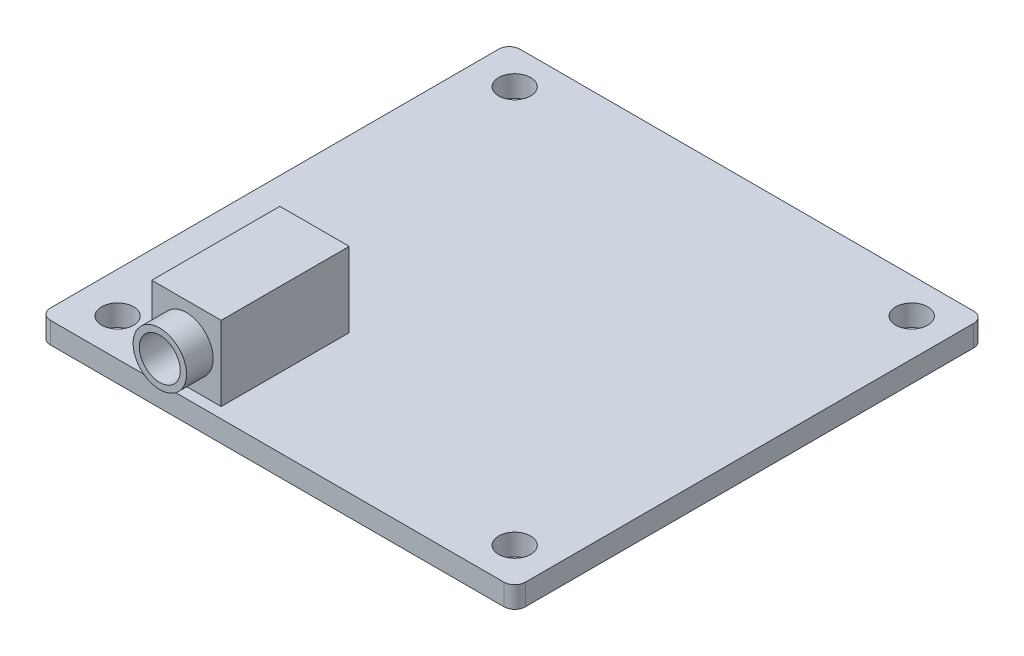
ISO-10303-21;
HEADER;
FILE_DESCRIPTION(('STEP AP214'),'2;1');
FILE_NAME('part.step','',(''),(''),'','','');
FILE_SCHEMA(('AUTOMOTIVE_DESIGN { 1 0 10303 214 1 1 1 1 }'));
ENDSEC;
DATA;
#1=APPLICATION_CONTEXT('core data for automotive mechanical design processes');
#2=APPLICATION_PROTOCOL_DEFINITION('international standard','automotive_design',2000,#1);
#3=PRODUCT_CONTEXT('',#1,'mechanical');
#4=PRODUCT('Part','Part','',(#3));
#5=PRODUCT_RELATED_PRODUCT_CATEGORY('part','',(#4));
#6=PRODUCT_DEFINITION_FORMATION('','',#4);
#7=PRODUCT_DEFINITION_CONTEXT('part definition',#1,'design');
#8=PRODUCT_DEFINITION('design','',#6,#7);
#9=PRODUCT_DEFINITION_SHAPE('','',#8);
#10=(LENGTH_UNIT() NAMED_UNIT(*) SI_UNIT(.MILLI.,.METRE.));
#11=(NAMED_UNIT(*) PLANE_ANGLE_UNIT() SI_UNIT($,.RADIAN.));
#12=(NAMED_UNIT(*) SI_UNIT($,.STERADIAN.) SOLID_ANGLE_UNIT());
#13=UNCERTAINTY_MEASURE_WITH_UNIT(LENGTH_MEASURE(1.E-05),#10,'distance_accuracy_value','');
#14=(GEOMETRIC_REPRESENTATION_CONTEXT(3) GLOBAL_UNCERTAINTY_ASSIGNED_CONTEXT((#13)) GLOBAL_UNIT_ASSIGNED_CONTEXT((#10,
#11,#12)) REPRESENTATION_CONTEXT('',''));
#15=CARTESIAN_POINT('',(0.,0.,0.));
#16=DIRECTION('',(0.,0.,1.));
#17=DIRECTION('',(1.,0.,0.));
#18=AXIS2_PLACEMENT_3D('',#15,#16,#17);
#19=CARTESIAN_POINT('',(0.,2.,0.));
#20=DIRECTION('',(0.,-1.,0.));
#21=DIRECTION('',(0.,0.,-1.));
#22=AXIS2_PLACEMENT_3D('',#19,#20,#21);
#23=PLANE('',#22);
#24=DIRECTION('',(0.,0.,1.));
#25=VECTOR('',#24,1.);
#26=CARTESIAN_POINT('',(0.,2.,0.));
#27=LINE('',#26,#25);
#28=CARTESIAN_POINT('',(0.,2.,-43.));
#29=VERTEX_POINT('',#28);
#30=CARTESIAN_POINT('',(0.,2.,-1.));
#31=VERTEX_POINT('',#30);
#32=EDGE_CURVE('E180',#29,#31,#27,.T.);
#33=ORIENTED_EDGE('',*,*,#32,.T.);
#34=CARTESIAN_POINT('',(1.,2.,-1.));
#35=DIRECTION('',(0.,-1.,0.));
#36=DIRECTION('',(0.,0.,-1.));
#37=AXIS2_PLACEMENT_3D('',#34,#35,#36);
#38=CIRCLE('',#37,1.);
#39=CARTESIAN_POINT('',(1.,2.,0.));
#40=VERTEX_POINT('',#39);
#41=EDGE_CURVE('E226',#31,#40,#38,.F.);
#42=ORIENTED_EDGE('',*,*,#41,.T.);
#43=DIRECTION('',(1.,0.,0.));
#44=VECTOR('',#43,1.);
#45=CARTESIAN_POINT('',(0.,2.,0.));
#46=LINE('',#45,#44);
#47=CARTESIAN_POINT('',(43.5,2.,0.));
#48=VERTEX_POINT('',#47);
#49=EDGE_CURVE('E183',#40,#48,#46,.T.);
#50=ORIENTED_EDGE('',*,*,#49,.T.);
#51=CARTESIAN_POINT('',(43.5,2.,-1.));
#52=DIRECTION('',(0.,-1.,0.));
#53=DIRECTION('',(0.,0.,-1.));
#54=AXIS2_PLACEMENT_3D('',#51,#52,#53);
#55=CIRCLE('',#54,1.);
#56=CARTESIAN_POINT('',(44.5,2.,-1.));
#57=VERTEX_POINT('',#56);
#58=EDGE_CURVE('E224',#48,#57,#55,.F.);
#59=ORIENTED_EDGE('',*,*,#58,.T.);
#60=DIRECTION('',(0.,0.,-1.));
#61=VECTOR('',#60,1.);
#62=CARTESIAN_POINT('',(44.5,2.,0.));
#63=LINE('',#62,#61);
#64=CARTESIAN_POINT('',(44.5,2.,-43.));
#65=VERTEX_POINT('',#64);
#66=EDGE_CURVE('E187',#57,#65,#63,.T.);
#67=ORIENTED_EDGE('',*,*,#66,.T.);
#68=CARTESIAN_POINT('',(43.5,2.,-43.));
#69=DIRECTION('',(0.,-1.,0.));
#70=DIRECTION('',(0.,0.,-1.));
#71=AXIS2_PLACEMENT_3D('',#68,#69,#70);
#72=CIRCLE('',#71,1.);
#73=CARTESIAN_POINT('',(43.5,2.,-44.));
#74=VERTEX_POINT('',#73);
#75=EDGE_CURVE('E56',#65,#74,#72,.F.);
#76=ORIENTED_EDGE('',*,*,#75,.T.);
#77=DIRECTION('',(-1.,0.,0.));
#78=VECTOR('',#77,1.);
#79=CARTESIAN_POINT('',(0.,2.,-44.));
#80=LINE('',#79,#78);
#81=CARTESIAN_POINT('',(1.,2.,-44.));
#82=VERTEX_POINT('',#81);
#83=EDGE_CURVE('E189',#74,#82,#80,.T.);
#84=ORIENTED_EDGE('',*,*,#83,.T.);
#85=CARTESIAN_POINT('',(1.,2.,-43.));
#86=DIRECTION('',(0.,-1.,0.));
#87=DIRECTION('',(0.,0.,-1.));
#88=AXIS2_PLACEMENT_3D('',#85,#86,#87);
#89=CIRCLE('',#88,1.);
#90=EDGE_CURVE('E221',#82,#29,#89,.F.);
#91=ORIENTED_EDGE('',*,*,#90,.T.);
#92=EDGE_LOOP('',(#33,#42,#50,#59,#67,#76,#84,#91));
#93=FACE_BOUND('',#92,.T.);
#94=CARTESIAN_POINT('',(3.79999999999999,2.,-40.7));
#95=DIRECTION('',(0.,1.,0.));
#96=DIRECTION('',(0.,0.,1.));
#97=AXIS2_PLACEMENT_3D('',#94,#95,#96);
#98=CIRCLE('',#97,1.5);
#99=CARTESIAN_POINT('',(3.79999999999999,2.,-39.2));
#100=VERTEX_POINT('',#99);
#101=EDGE_CURVE('E171',#100,#100,#98,.T.);
#102=ORIENTED_EDGE('',*,*,#101,.F.);
#103=EDGE_LOOP('',(#102));
#104=FACE_BOUND('',#103,.T.);
#105=CARTESIAN_POINT('',(3.8,2.,-3.5));
#106=DIRECTION('',(0.,1.,0.));
#107=DIRECTION('',(0.,0.,1.));
#108=AXIS2_PLACEMENT_3D('',#105,#106,#107);
#109=CIRCLE('',#108,1.5);
#110=CARTESIAN_POINT('',(3.8,2.,-2.));
#111=VERTEX_POINT('',#110);
#112=EDGE_CURVE('E165',#111,#111,#109,.T.);
#113=ORIENTED_EDGE('',*,*,#112,.F.);
#114=EDGE_LOOP('',(#113));
#115=FACE_BOUND('',#114,.T.);
#116=CARTESIAN_POINT('',(41.,2.,-3.5));
#117=DIRECTION('',(0.,1.,0.));
#118=DIRECTION('',(0.,0.,1.));
#119=AXIS2_PLACEMENT_3D('',#116,#117,#118);
#120=CIRCLE('',#119,1.5);
#121=CARTESIAN_POINT('',(41.,2.,-2.));
#122=VERTEX_POINT('',#121);
#123=EDGE_CURVE('E160',#122,#122,#120,.T.);
#124=ORIENTED_EDGE('',*,*,#123,.F.);
#125=EDGE_LOOP('',(#124));
#126=FACE_BOUND('',#125,.T.);
#127=CARTESIAN_POINT('',(41.,2.,-40.7));
#128=DIRECTION('',(0.,1.,0.));
#129=DIRECTION('',(0.,0.,1.));
#130=AXIS2_PLACEMENT_3D('',#127,#128,#129);
#131=CIRCLE('',#130,1.5);
#132=CARTESIAN_POINT('',(41.,2.,-39.2));
#133=VERTEX_POINT('',#132);
#134=EDGE_CURVE('E150',#133,#133,#131,.T.);
#135=ORIENTED_EDGE('',*,*,#134,.F.);
#136=EDGE_LOOP('',(#135));
#137=FACE_BOUND('',#136,.T.);
#138=DIRECTION('',(0.,0.,1.));
#139=VECTOR('',#138,1.);
#140=CARTESIAN_POINT('',(9.5,2.,-13.));
#141=LINE('',#140,#139);
#142=CARTESIAN_POINT('',(9.5,2.,-13.));
#143=VERTEX_POINT('',#142);
#144=CARTESIAN_POINT('',(9.5,2.,-1.));
#145=VERTEX_POINT('',#144);
#146=EDGE_CURVE('E149',#143,#145,#141,.T.);
#147=ORIENTED_EDGE('',*,*,#146,.F.);
#148=DIRECTION('',(-1.,0.,0.));
#149=VECTOR('',#148,1.);
#150=CARTESIAN_POINT('',(9.5,2.,-13.));
#151=LINE('',#150,#149);
#152=CARTESIAN_POINT('',(16.,2.,-13.));
#153=VERTEX_POINT('',#152);
#154=EDGE_CURVE('E146',#153,#143,#151,.T.);
#155=ORIENTED_EDGE('',*,*,#154,.F.);
#156=DIRECTION('',(0.,0.,-1.));
#157=VECTOR('',#156,1.);
#158=CARTESIAN_POINT('',(16.,2.,-13.));
#159=LINE('',#158,#157);
#160=CARTESIAN_POINT('',(16.,2.,-1.));
#161=VERTEX_POINT('',#160);
#162=EDGE_CURVE('E489',#161,#153,#159,.T.);
#163=ORIENTED_EDGE('',*,*,#162,.F.);
#164=DIRECTION('',(1.,0.,0.));
#165=VECTOR('',#164,1.);
#166=CARTESIAN_POINT('',(9.5,2.,-1.));
#167=LINE('',#166,#165);
#168=EDGE_CURVE('E487',#145,#161,#167,.T.);
#169=ORIENTED_EDGE('',*,*,#168,.F.);
#170=EDGE_LOOP('',(#147,#155,#163,#169));
#171=FACE_BOUND('',#170,.T.);
#172=ADVANCED_FACE('F35',(#93,#104,#115,#126,#137,#171),#23,.F.);
#173=CARTESIAN_POINT('',(0.,2.,0.));
#174=DIRECTION('',(1.,0.,0.));
#175=DIRECTION('',(0.,0.,-1.));
#176=AXIS2_PLACEMENT_3D('',#173,#174,#175);
#177=PLANE('',#176);
#178=DIRECTION('',(0.,0.,1.));
#179=VECTOR('',#178,1.);
#180=CARTESIAN_POINT('',(0.,0.,0.));
#181=LINE('',#180,#179);
#182=CARTESIAN_POINT('',(0.,0.,-43.));
#183=VERTEX_POINT('',#182);
#184=CARTESIAN_POINT('',(0.,0.,-1.));
#185=VERTEX_POINT('',#184);
#186=EDGE_CURVE('E177',#183,#185,#181,.T.);
#187=ORIENTED_EDGE('',*,*,#186,.T.);
#188=DIRECTION('',(0.,-1.,0.));
#189=VECTOR('',#188,1.);
#190=CARTESIAN_POINT('',(0.,2.,-1.));
#191=LINE('',#190,#189);
#192=EDGE_CURVE('E219',#185,#31,#191,.F.);
#193=ORIENTED_EDGE('',*,*,#192,.T.);
#194=ORIENTED_EDGE('',*,*,#32,.F.);
#195=DIRECTION('',(0.,-1.,0.));
#196=VECTOR('',#195,1.);
#197=CARTESIAN_POINT('',(0.,2.,-43.));
#198=LINE('',#197,#196);
#199=EDGE_CURVE('E216',#29,#183,#198,.T.);
#200=ORIENTED_EDGE('',*,*,#199,.T.);
#201=EDGE_LOOP('',(#187,#193,#194,#200));
#202=FACE_BOUND('',#201,.T.);
#203=ADVANCED_FACE('F255',(#202),#177,.F.);
#204=CARTESIAN_POINT('',(0.,2.,0.));
#205=DIRECTION('',(0.,0.,-1.));
#206=DIRECTION('',(-1.,0.,0.));
#207=AXIS2_PLACEMENT_3D('',#204,#205,#206);
#208=PLANE('',#207);
#209=ORIENTED_EDGE('',*,*,#49,.F.);
#210=DIRECTION('',(0.,-1.,0.));
#211=VECTOR('',#210,1.);
#212=CARTESIAN_POINT('',(1.,2.,0.));
#213=LINE('',#212,#211);
#214=CARTESIAN_POINT('',(1.,0.,0.));
#215=VERTEX_POINT('',#214);
#216=EDGE_CURVE('E205',#40,#215,#213,.T.);
#217=ORIENTED_EDGE('',*,*,#216,.T.);
#218=DIRECTION('',(1.,0.,0.));
#219=VECTOR('',#218,1.);
#220=CARTESIAN_POINT('',(0.,0.,0.));
#221=LINE('',#220,#219);
#222=CARTESIAN_POINT('',(43.5,0.,0.));
#223=VERTEX_POINT('',#222);
#224=EDGE_CURVE('E194',#215,#223,#221,.T.);
#225=ORIENTED_EDGE('',*,*,#224,.T.);
#226=DIRECTION('',(0.,-1.,0.));
#227=VECTOR('',#226,1.);
#228=CARTESIAN_POINT('',(43.5,2.,0.));
#229=LINE('',#228,#227);
#230=EDGE_CURVE('E203',#223,#48,#229,.F.);
#231=ORIENTED_EDGE('',*,*,#230,.T.);
#232=EDGE_LOOP('',(#209,#217,#225,#231));
#233=FACE_BOUND('',#232,.T.);
#234=ADVANCED_FACE('F263',(#233),#208,.F.);
#235=CARTESIAN_POINT('',(44.5,2.,0.));
#236=DIRECTION('',(-1.,0.,0.));
#237=DIRECTION('',(0.,0.,1.));
#238=AXIS2_PLACEMENT_3D('',#235,#236,#237);
#239=PLANE('',#238);
#240=ORIENTED_EDGE('',*,*,#66,.F.);
#241=DIRECTION('',(0.,-1.,0.));
#242=VECTOR('',#241,1.);
#243=CARTESIAN_POINT('',(44.5,2.,-1.));
#244=LINE('',#243,#242);
#245=CARTESIAN_POINT('',(44.5,0.,-1.));
#246=VERTEX_POINT('',#245);
#247=EDGE_CURVE('E230',#57,#246,#244,.T.);
#248=ORIENTED_EDGE('',*,*,#247,.T.);
#249=DIRECTION('',(0.,0.,-1.));
#250=VECTOR('',#249,1.);
#251=CARTESIAN_POINT('',(44.5,0.,0.));
#252=LINE('',#251,#250);
#253=CARTESIAN_POINT('',(44.5,0.,-43.));
#254=VERTEX_POINT('',#253);
#255=EDGE_CURVE('E197',#246,#254,#252,.T.);
#256=ORIENTED_EDGE('',*,*,#255,.T.);
#257=DIRECTION('',(0.,-1.,0.));
#258=VECTOR('',#257,1.);
#259=CARTESIAN_POINT('',(44.5,2.,-43.));
#260=LINE('',#259,#258);
#261=EDGE_CURVE('E228',#254,#65,#260,.F.);
#262=ORIENTED_EDGE('',*,*,#261,.T.);
#263=EDGE_LOOP('',(#240,#248,#256,#262));
#264=FACE_BOUND('',#263,.T.);
#265=ADVANCED_FACE('F236',(#264),#239,.F.);
#266=CARTESIAN_POINT('',(0.,2.,-44.));
#267=DIRECTION('',(0.,0.,1.));
#268=DIRECTION('',(1.,0.,0.));
#269=AXIS2_PLACEMENT_3D('',#266,#267,#268);
#270=PLANE('',#269);
#271=ORIENTED_EDGE('',*,*,#83,.F.);
#272=DIRECTION('',(0.,-1.,0.));
#273=VECTOR('',#272,1.);
#274=CARTESIAN_POINT('',(43.5,2.,-44.));
#275=LINE('',#274,#273);
#276=CARTESIAN_POINT('',(43.5,0.,-44.));
#277=VERTEX_POINT('',#276);
#278=EDGE_CURVE('E11',#74,#277,#275,.T.);
#279=ORIENTED_EDGE('',*,*,#278,.T.);
#280=DIRECTION('',(-1.,0.,0.));
#281=VECTOR('',#280,1.);
#282=CARTESIAN_POINT('',(0.,0.,-44.));
#283=LINE('',#282,#281);
#284=CARTESIAN_POINT('',(1.,0.,-44.));
#285=VERTEX_POINT('',#284);
#286=EDGE_CURVE('E184',#277,#285,#283,.T.);
#287=ORIENTED_EDGE('',*,*,#286,.T.);
#288=DIRECTION('',(0.,-1.,0.));
#289=VECTOR('',#288,1.);
#290=CARTESIAN_POINT('',(1.,2.,-44.));
#291=LINE('',#290,#289);
#292=EDGE_CURVE('E43',#285,#82,#291,.F.);
#293=ORIENTED_EDGE('',*,*,#292,.T.);
#294=EDGE_LOOP('',(#271,#279,#287,#293));
#295=FACE_BOUND('',#294,.T.);
#296=ADVANCED_FACE('F247',(#295),#270,.F.);
#297=CARTESIAN_POINT('',(0.,0.,0.));
#298=DIRECTION('',(0.,-1.,0.));
#299=DIRECTION('',(0.,0.,-1.));
#300=AXIS2_PLACEMENT_3D('',#297,#298,#299);
#301=PLANE('',#300);
#302=CARTESIAN_POINT('',(41.,0.,-40.7));
#303=DIRECTION('',(0.,1.,0.));
#304=DIRECTION('',(0.,0.,1.));
#305=AXIS2_PLACEMENT_3D('',#302,#303,#304);
#306=CIRCLE('',#305,1.5);
#307=CARTESIAN_POINT('',(41.,0.,-39.2));
#308=VERTEX_POINT('',#307);
#309=EDGE_CURVE('E153',#308,#308,#306,.T.);
#310=ORIENTED_EDGE('',*,*,#309,.T.);
#311=EDGE_LOOP('',(#310));
#312=FACE_BOUND('',#311,.T.);
#313=CARTESIAN_POINT('',(41.,0.,-3.5));
#314=DIRECTION('',(0.,1.,0.));
#315=DIRECTION('',(0.,0.,1.));
#316=AXIS2_PLACEMENT_3D('',#313,#314,#315);
#317=CIRCLE('',#316,1.5);
#318=CARTESIAN_POINT('',(41.,0.,-2.));
#319=VERTEX_POINT('',#318);
#320=EDGE_CURVE('E162',#319,#319,#317,.T.);
#321=ORIENTED_EDGE('',*,*,#320,.T.);
#322=EDGE_LOOP('',(#321));
#323=FACE_BOUND('',#322,.T.);
#324=CARTESIAN_POINT('',(3.8,0.,-3.5));
#325=DIRECTION('',(0.,1.,0.));
#326=DIRECTION('',(0.,0.,1.));
#327=AXIS2_PLACEMENT_3D('',#324,#325,#326);
#328=CIRCLE('',#327,1.5);
#329=CARTESIAN_POINT('',(3.8,0.,-2.));
#330=VERTEX_POINT('',#329);
#331=EDGE_CURVE('E168',#330,#330,#328,.T.);
#332=ORIENTED_EDGE('',*,*,#331,.T.);
#333=EDGE_LOOP('',(#332));
#334=FACE_BOUND('',#333,.T.);
#335=CARTESIAN_POINT('',(3.79999999999999,0.,-40.7));
#336=DIRECTION('',(0.,1.,0.));
#337=DIRECTION('',(0.,0.,1.));
#338=AXIS2_PLACEMENT_3D('',#335,#336,#337);
#339=CIRCLE('',#338,1.5);
#340=CARTESIAN_POINT('',(3.79999999999999,0.,-39.2));
#341=VERTEX_POINT('',#340);
#342=EDGE_CURVE('E174',#341,#341,#339,.T.);
#343=ORIENTED_EDGE('',*,*,#342,.T.);
#344=EDGE_LOOP('',(#343));
#345=FACE_BOUND('',#344,.T.);
#346=ORIENTED_EDGE('',*,*,#224,.F.);
#347=CARTESIAN_POINT('',(1.,0.,-1.));
#348=DIRECTION('',(0.,-1.,0.));
#349=DIRECTION('',(0.,0.,-1.));
#350=AXIS2_PLACEMENT_3D('',#347,#348,#349);
#351=CIRCLE('',#350,1.);
#352=EDGE_CURVE('E214',#215,#185,#351,.T.);
#353=ORIENTED_EDGE('',*,*,#352,.T.);
#354=ORIENTED_EDGE('',*,*,#186,.F.);
#355=CARTESIAN_POINT('',(1.,0.,-43.));
#356=DIRECTION('',(0.,-1.,0.));
#357=DIRECTION('',(0.,0.,-1.));
#358=AXIS2_PLACEMENT_3D('',#355,#356,#357);
#359=CIRCLE('',#358,1.);
#360=EDGE_CURVE('E208',#183,#285,#359,.T.);
#361=ORIENTED_EDGE('',*,*,#360,.T.);
#362=ORIENTED_EDGE('',*,*,#286,.F.);
#363=CARTESIAN_POINT('',(43.5,0.,-43.));
#364=DIRECTION('',(0.,-1.,0.));
#365=DIRECTION('',(0.,0.,-1.));
#366=AXIS2_PLACEMENT_3D('',#363,#364,#365);
#367=CIRCLE('',#366,1.);
#368=EDGE_CURVE('E210',#277,#254,#367,.T.);
#369=ORIENTED_EDGE('',*,*,#368,.T.);
#370=ORIENTED_EDGE('',*,*,#255,.F.);
#371=CARTESIAN_POINT('',(43.5,0.,-1.));
#372=DIRECTION('',(0.,-1.,0.));
#373=DIRECTION('',(0.,0.,-1.));
#374=AXIS2_PLACEMENT_3D('',#371,#372,#373);
#375=CIRCLE('',#374,1.);
#376=EDGE_CURVE('E212',#246,#223,#375,.T.);
#377=ORIENTED_EDGE('',*,*,#376,.T.);
#378=EDGE_LOOP('',(#346,#353,#354,#361,#362,#369,#370,#377));
#379=FACE_BOUND('',#378,.T.);
#380=ADVANCED_FACE('F242',(#312,#323,#334,#345,#379),#301,.T.);
#381=CARTESIAN_POINT('',(3.79999999999999,0.,-40.7));
#382=DIRECTION('',(0.,1.,0.));
#383=DIRECTION('',(0.,0.,1.));
#384=AXIS2_PLACEMENT_3D('',#381,#382,#383);
#385=CYLINDRICAL_SURFACE('',#384,1.5);
#386=ORIENTED_EDGE('',*,*,#342,.F.);
#387=EDGE_LOOP('',(#386));
#388=FACE_BOUND('',#387,.T.);
#389=ORIENTED_EDGE('',*,*,#101,.T.);
#390=EDGE_LOOP('',(#389));
#391=FACE_BOUND('',#390,.T.);
#392=ADVANCED_FACE('F282',(#388,#391),#385,.F.);
#393=CARTESIAN_POINT('',(3.8,0.,-3.5));
#394=DIRECTION('',(0.,1.,0.));
#395=DIRECTION('',(0.,0.,1.));
#396=AXIS2_PLACEMENT_3D('',#393,#394,#395);
#397=CYLINDRICAL_SURFACE('',#396,1.5);
#398=ORIENTED_EDGE('',*,*,#331,.F.);
#399=EDGE_LOOP('',(#398));
#400=FACE_BOUND('',#399,.T.);
#401=ORIENTED_EDGE('',*,*,#112,.T.);
#402=EDGE_LOOP('',(#401));
#403=FACE_BOUND('',#402,.T.);
#404=ADVANCED_FACE('F315',(#400,#403),#397,.F.);
#405=CARTESIAN_POINT('',(41.,0.,-3.5));
#406=DIRECTION('',(0.,1.,0.));
#407=DIRECTION('',(0.,0.,1.));
#408=AXIS2_PLACEMENT_3D('',#405,#406,#407);
#409=CYLINDRICAL_SURFACE('',#408,1.5);
#410=ORIENTED_EDGE('',*,*,#320,.F.);
#411=EDGE_LOOP('',(#410));
#412=FACE_BOUND('',#411,.T.);
#413=ORIENTED_EDGE('',*,*,#123,.T.);
#414=EDGE_LOOP('',(#413));
#415=FACE_BOUND('',#414,.T.);
#416=ADVANCED_FACE('F322',(#412,#415),#409,.F.);
#417=CARTESIAN_POINT('',(41.,0.,-40.7));
#418=DIRECTION('',(0.,1.,0.));
#419=DIRECTION('',(0.,0.,1.));
#420=AXIS2_PLACEMENT_3D('',#417,#418,#419);
#421=CYLINDRICAL_SURFACE('',#420,1.5);
#422=ORIENTED_EDGE('',*,*,#309,.F.);
#423=EDGE_LOOP('',(#422));
#424=FACE_BOUND('',#423,.T.);
#425=ORIENTED_EDGE('',*,*,#134,.T.);
#426=EDGE_LOOP('',(#425));
#427=FACE_BOUND('',#426,.T.);
#428=ADVANCED_FACE('F329',(#424,#427),#421,.F.);
#429=CARTESIAN_POINT('',(9.5,9.,-13.));
#430=DIRECTION('',(1.,0.,0.));
#431=DIRECTION('',(0.,0.,-1.));
#432=AXIS2_PLACEMENT_3D('',#429,#430,#431);
#433=PLANE('',#432);
#434=ORIENTED_EDGE('',*,*,#146,.T.);
#435=DIRECTION('',(0.,-1.,0.));
#436=VECTOR('',#435,1.);
#437=CARTESIAN_POINT('',(9.5,9.,-1.));
#438=LINE('',#437,#436);
#439=CARTESIAN_POINT('',(9.5,9.,-1.));
#440=VERTEX_POINT('',#439);
#441=EDGE_CURVE('E130',#440,#145,#438,.T.);
#442=ORIENTED_EDGE('',*,*,#441,.F.);
#443=DIRECTION('',(0.,0.,1.));
#444=VECTOR('',#443,1.);
#445=CARTESIAN_POINT('',(9.5,9.,-13.));
#446=LINE('',#445,#444);
#447=CARTESIAN_POINT('',(9.5,9.,-13.));
#448=VERTEX_POINT('',#447);
#449=EDGE_CURVE('E137',#448,#440,#446,.T.);
#450=ORIENTED_EDGE('',*,*,#449,.F.);
#451=DIRECTION('',(0.,-1.,0.));
#452=VECTOR('',#451,1.);
#453=CARTESIAN_POINT('',(9.5,9.,-13.));
#454=LINE('',#453,#452);
#455=EDGE_CURVE('E485',#448,#143,#454,.T.);
#456=ORIENTED_EDGE('',*,*,#455,.T.);
#457=EDGE_LOOP('',(#434,#442,#450,#456));
#458=FACE_BOUND('',#457,.T.);
#459=ADVANCED_FACE('F148',(#458),#433,.F.);
#460=CARTESIAN_POINT('',(9.5,9.,-1.));
#461=DIRECTION('',(0.,0.,-1.));
#462=DIRECTION('',(-1.,0.,0.));
#463=AXIS2_PLACEMENT_3D('',#460,#461,#462);
#464=PLANE('',#463);
#465=CARTESIAN_POINT('',(12.75,5.5,-1.));
#466=DIRECTION('',(0.,0.,-1.));
#467=DIRECTION('',(-1.,0.,0.));
#468=AXIS2_PLACEMENT_3D('',#465,#466,#467);
#469=CIRCLE('',#468,2.5);
#470=CARTESIAN_POINT('',(10.25,5.5,-1.));
#471=VERTEX_POINT('',#470);
#472=EDGE_CURVE('E191',#471,#471,#469,.F.);
#473=ORIENTED_EDGE('',*,*,#472,.F.);
#474=EDGE_LOOP('',(#473));
#475=FACE_BOUND('',#474,.T.);
#476=ORIENTED_EDGE('',*,*,#168,.T.);
#477=DIRECTION('',(0.,-1.,0.));
#478=VECTOR('',#477,1.);
#479=CARTESIAN_POINT('',(16.,9.,-1.));
#480=LINE('',#479,#478);
#481=CARTESIAN_POINT('',(16.,9.,-1.));
#482=VERTEX_POINT('',#481);
#483=EDGE_CURVE('E133',#482,#161,#480,.T.);
#484=ORIENTED_EDGE('',*,*,#483,.F.);
#485=DIRECTION('',(1.,0.,0.));
#486=VECTOR('',#485,1.);
#487=CARTESIAN_POINT('',(9.5,9.,-1.));
#488=LINE('',#487,#486);
#489=EDGE_CURVE('E125',#440,#482,#488,.T.);
#490=ORIENTED_EDGE('',*,*,#489,.F.);
#491=ORIENTED_EDGE('',*,*,#441,.T.);
#492=EDGE_LOOP('',(#476,#484,#490,#491));
#493=FACE_BOUND('',#492,.T.);
#494=ADVANCED_FACE('F128',(#475,#493),#464,.F.);
#495=CARTESIAN_POINT('',(16.,9.,-13.));
#496=DIRECTION('',(-1.,0.,0.));
#497=DIRECTION('',(0.,0.,1.));
#498=AXIS2_PLACEMENT_3D('',#495,#496,#497);
#499=PLANE('',#498);
#500=ORIENTED_EDGE('',*,*,#162,.T.);
#501=DIRECTION('',(0.,-1.,0.));
#502=VECTOR('',#501,1.);
#503=CARTESIAN_POINT('',(16.,9.,-13.));
#504=LINE('',#503,#502);
#505=CARTESIAN_POINT('',(16.,9.,-13.));
#506=VERTEX_POINT('',#505);
#507=EDGE_CURVE('E155',#506,#153,#504,.T.);
#508=ORIENTED_EDGE('',*,*,#507,.F.);
#509=DIRECTION('',(0.,0.,-1.));
#510=VECTOR('',#509,1.);
#511=CARTESIAN_POINT('',(16.,9.,-13.));
#512=LINE('',#511,#510);
#513=EDGE_CURVE('E136',#482,#506,#512,.T.);
#514=ORIENTED_EDGE('',*,*,#513,.F.);
#515=ORIENTED_EDGE('',*,*,#483,.T.);
#516=EDGE_LOOP('',(#500,#508,#514,#515));
#517=FACE_BOUND('',#516,.T.);
#518=ADVANCED_FACE('F351',(#517),#499,.F.);
#519=CARTESIAN_POINT('',(9.5,9.,-13.));
#520=DIRECTION('',(0.,0.,1.));
#521=DIRECTION('',(1.,0.,0.));
#522=AXIS2_PLACEMENT_3D('',#519,#520,#521);
#523=PLANE('',#522);
#524=ORIENTED_EDGE('',*,*,#154,.T.);
#525=ORIENTED_EDGE('',*,*,#455,.F.);
#526=DIRECTION('',(-1.,0.,0.));
#527=VECTOR('',#526,1.);
#528=CARTESIAN_POINT('',(9.5,9.,-13.));
#529=LINE('',#528,#527);
#530=EDGE_CURVE('E142',#506,#448,#529,.T.);
#531=ORIENTED_EDGE('',*,*,#530,.F.);
#532=ORIENTED_EDGE('',*,*,#507,.T.);
#533=EDGE_LOOP('',(#524,#525,#531,#532));
#534=FACE_BOUND('',#533,.T.);
#535=ADVANCED_FACE('F360',(#534),#523,.F.);
#536=CARTESIAN_POINT('',(0.,9.,0.));
#537=DIRECTION('',(0.,1.,0.));
#538=DIRECTION('',(0.,0.,1.));
#539=AXIS2_PLACEMENT_3D('',#536,#537,#538);
#540=PLANE('',#539);
#541=ORIENTED_EDGE('',*,*,#449,.T.);
#542=ORIENTED_EDGE('',*,*,#489,.T.);
#543=ORIENTED_EDGE('',*,*,#513,.T.);
#544=ORIENTED_EDGE('',*,*,#530,.T.);
#545=EDGE_LOOP('',(#541,#542,#543,#544));
#546=FACE_BOUND('',#545,.T.);
#547=ADVANCED_FACE('F140',(#546),#540,.T.);
#548=CARTESIAN_POINT('',(12.75,5.5,1.5));
#549=DIRECTION('',(0.,0.,-1.));
#550=DIRECTION('',(-1.,0.,0.));
#551=AXIS2_PLACEMENT_3D('',#548,#549,#550);
#552=CYLINDRICAL_SURFACE('',#551,2.5);
#553=CARTESIAN_POINT('',(12.75,5.5,1.5));
#554=DIRECTION('',(0.,0.,1.));
#555=DIRECTION('',(1.,0.,0.));
#556=AXIS2_PLACEMENT_3D('',#553,#554,#555);
#557=CIRCLE('',#556,2.5);
#558=CARTESIAN_POINT('',(15.25,5.5,1.5));
#559=VERTEX_POINT('',#558);
#560=EDGE_CURVE('E475',#559,#559,#557,.T.);
#561=ORIENTED_EDGE('',*,*,#560,.F.);
#562=EDGE_LOOP('',(#561));
#563=FACE_BOUND('',#562,.T.);
#564=ORIENTED_EDGE('',*,*,#472,.T.);
#565=EDGE_LOOP('',(#564));
#566=FACE_BOUND('',#565,.T.);
#567=ADVANCED_FACE('F374',(#563,#566),#552,.T.);
#568=CARTESIAN_POINT('',(12.75,5.5,1.5));
#569=DIRECTION('',(0.,0.,1.));
#570=DIRECTION('',(1.,0.,0.));
#571=AXIS2_PLACEMENT_3D('',#568,#569,#570);
#572=PLANE('',#571);
#573=CARTESIAN_POINT('',(12.75,5.5,1.5));
#574=DIRECTION('',(0.,0.,1.));
#575=DIRECTION('',(1.,0.,0.));
#576=AXIS2_PLACEMENT_3D('',#573,#574,#575);
#577=CIRCLE('',#576,1.9209613747847);
#578=CARTESIAN_POINT('',(14.6709613747847,5.5,1.5));
#579=VERTEX_POINT('',#578);
#580=EDGE_CURVE('E476',#579,#579,#577,.T.);
#581=ORIENTED_EDGE('',*,*,#580,.F.);
#582=EDGE_LOOP('',(#581));
#583=FACE_BOUND('',#582,.T.);
#584=ORIENTED_EDGE('',*,*,#560,.T.);
#585=EDGE_LOOP('',(#584));
#586=FACE_BOUND('',#585,.T.);
#587=ADVANCED_FACE('F380',(#583,#586),#572,.T.);
#588=CARTESIAN_POINT('',(12.75,5.5,-10.));
#589=DIRECTION('',(0.,0.,1.));
#590=DIRECTION('',(1.,0.,0.));
#591=AXIS2_PLACEMENT_3D('',#588,#589,#590);
#592=CYLINDRICAL_SURFACE('',#591,1.9209613747847);
#593=CARTESIAN_POINT('',(12.75,5.5,-10.));
#594=DIRECTION('',(0.,0.,1.));
#595=DIRECTION('',(1.,0.,0.));
#596=AXIS2_PLACEMENT_3D('',#593,#594,#595);
#597=CIRCLE('',#596,1.9209613747847);
#598=CARTESIAN_POINT('',(14.6709613747847,5.5,-10.));
#599=VERTEX_POINT('',#598);
#600=EDGE_CURVE('E474',#599,#599,#597,.T.);
#601=ORIENTED_EDGE('',*,*,#600,.F.);
#602=EDGE_LOOP('',(#601));
#603=FACE_BOUND('',#602,.T.);
#604=ORIENTED_EDGE('',*,*,#580,.T.);
#605=EDGE_LOOP('',(#604));
#606=FACE_BOUND('',#605,.T.);
#607=ADVANCED_FACE('F388',(#603,#606),#592,.F.);
#608=CARTESIAN_POINT('',(12.75,5.5,-10.));
#609=DIRECTION('',(0.,0.,1.));
#610=DIRECTION('',(1.,0.,0.));
#611=AXIS2_PLACEMENT_3D('',#608,#609,#610);
#612=PLANE('',#611);
#613=ORIENTED_EDGE('',*,*,#600,.T.);
#614=EDGE_LOOP('',(#613));
#615=FACE_BOUND('',#614,.T.);
#616=ADVANCED_FACE('F272',(#615),#612,.T.);
#617=CARTESIAN_POINT('',(1.,2.,-1.));
#618=DIRECTION('',(0.,-1.,0.));
#619=DIRECTION('',(0.,0.,-1.));
#620=AXIS2_PLACEMENT_3D('',#617,#618,#619);
#621=CYLINDRICAL_SURFACE('',#620,1.);
#622=ORIENTED_EDGE('',*,*,#41,.F.);
#623=ORIENTED_EDGE('',*,*,#192,.F.);
#624=ORIENTED_EDGE('',*,*,#352,.F.);
#625=ORIENTED_EDGE('',*,*,#216,.F.);
#626=EDGE_LOOP('',(#622,#623,#624,#625));
#627=FACE_BOUND('',#626,.T.);
#628=ADVANCED_FACE('F260',(#627),#621,.T.);
#629=CARTESIAN_POINT('',(43.5,2.,-1.));
#630=DIRECTION('',(0.,-1.,0.));
#631=DIRECTION('',(0.,0.,-1.));
#632=AXIS2_PLACEMENT_3D('',#629,#630,#631);
#633=CYLINDRICAL_SURFACE('',#632,1.);
#634=ORIENTED_EDGE('',*,*,#58,.F.);
#635=ORIENTED_EDGE('',*,*,#230,.F.);
#636=ORIENTED_EDGE('',*,*,#376,.F.);
#637=ORIENTED_EDGE('',*,*,#247,.F.);
#638=EDGE_LOOP('',(#634,#635,#636,#637));
#639=FACE_BOUND('',#638,.T.);
#640=ADVANCED_FACE('F265',(#639),#633,.T.);
#641=CARTESIAN_POINT('',(43.5,2.,-43.));
#642=DIRECTION('',(0.,-1.,0.));
#643=DIRECTION('',(0.,0.,-1.));
#644=AXIS2_PLACEMENT_3D('',#641,#642,#643);
#645=CYLINDRICAL_SURFACE('',#644,1.);
#646=ORIENTED_EDGE('',*,*,#75,.F.);
#647=ORIENTED_EDGE('',*,*,#261,.F.);
#648=ORIENTED_EDGE('',*,*,#368,.F.);
#649=ORIENTED_EDGE('',*,*,#278,.F.);
#650=EDGE_LOOP('',(#646,#647,#648,#649));
#651=FACE_BOUND('',#650,.T.);
#652=ADVANCED_FACE('F246',(#651),#645,.T.);
#653=CARTESIAN_POINT('',(1.,2.,-43.));
#654=DIRECTION('',(0.,-1.,0.));
#655=DIRECTION('',(0.,0.,-1.));
#656=AXIS2_PLACEMENT_3D('',#653,#654,#655);
#657=CYLINDRICAL_SURFACE('',#656,1.);
#658=ORIENTED_EDGE('',*,*,#90,.F.);
#659=ORIENTED_EDGE('',*,*,#292,.F.);
#660=ORIENTED_EDGE('',*,*,#360,.F.);
#661=ORIENTED_EDGE('',*,*,#199,.F.);
#662=EDGE_LOOP('',(#658,#659,#660,#661));
#663=FACE_BOUND('',#662,.T.);
#664=ADVANCED_FACE('F37',(#663),#657,.T.);
#665=CLOSED_SHELL('',(#172,#203,#234,#265,#296,#380,#392,#404,#416,#428,#459,#494,#518,#535,
#547,#567,#587,#607,#616,#628,#640,#652,#664));
#666=MANIFOLD_SOLID_BREP('B2',#665);
#667=ADVANCED_BREP_SHAPE_REPRESENTATION('',(#18,#666),#14);
#668=SHAPE_DEFINITION_REPRESENTATION(#9,#667);
ENDSEC;
END-ISO-10303-21;
